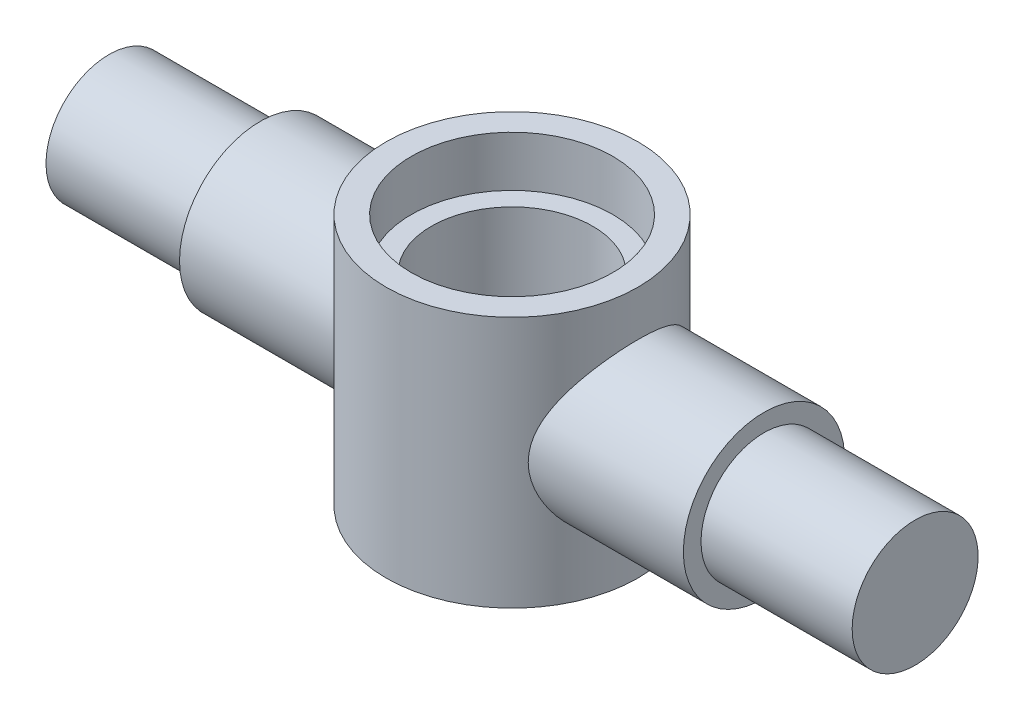
ISO-10303-21;
HEADER;
FILE_DESCRIPTION(('STEP AP214'),'2;1');
FILE_NAME('part.step','',(''),(''),'','','');
FILE_SCHEMA(('AUTOMOTIVE_DESIGN { 1 0 10303 214 1 1 1 1 }'));
ENDSEC;
DATA;
#1=APPLICATION_CONTEXT('core data for automotive mechanical design processes');
#2=APPLICATION_PROTOCOL_DEFINITION('international standard','automotive_design',2000,#1);
#3=PRODUCT_CONTEXT('',#1,'mechanical');
#4=PRODUCT('Part','Part','',(#3));
#5=PRODUCT_RELATED_PRODUCT_CATEGORY('part','',(#4));
#6=PRODUCT_DEFINITION_FORMATION('','',#4);
#7=PRODUCT_DEFINITION_CONTEXT('part definition',#1,'design');
#8=PRODUCT_DEFINITION('design','',#6,#7);
#9=PRODUCT_DEFINITION_SHAPE('','',#8);
#10=(LENGTH_UNIT() NAMED_UNIT(*) SI_UNIT(.MILLI.,.METRE.));
#11=(NAMED_UNIT(*) PLANE_ANGLE_UNIT() SI_UNIT($,.RADIAN.));
#12=(NAMED_UNIT(*) SI_UNIT($,.STERADIAN.) SOLID_ANGLE_UNIT());
#13=UNCERTAINTY_MEASURE_WITH_UNIT(LENGTH_MEASURE(1.E-05),#10,'distance_accuracy_value','');
#14=(GEOMETRIC_REPRESENTATION_CONTEXT(3) GLOBAL_UNCERTAINTY_ASSIGNED_CONTEXT((#13)) GLOBAL_UNIT_ASSIGNED_CONTEXT((#10,
#11,#12)) REPRESENTATION_CONTEXT('',''));
#15=CARTESIAN_POINT('',(0.,0.,0.));
#16=DIRECTION('',(0.,0.,1.));
#17=DIRECTION('',(1.,0.,0.));
#18=AXIS2_PLACEMENT_3D('',#15,#16,#17);
#19=CARTESIAN_POINT('',(0.,-25.,0.));
#20=DIRECTION('',(0.,1.,0.));
#21=DIRECTION('',(0.,0.,1.));
#22=AXIS2_PLACEMENT_3D('',#19,#20,#21);
#23=PLANE('',#22);
#24=CARTESIAN_POINT('',(0.,-25.,0.));
#25=DIRECTION('',(0.,1.,0.));
#26=DIRECTION('',(0.,0.,1.));
#27=AXIS2_PLACEMENT_3D('',#24,#25,#26);
#28=CIRCLE('',#27,25.);
#29=CARTESIAN_POINT('',(0.,-25.,25.));
#30=VERTEX_POINT('',#29);
#31=EDGE_CURVE('E50',#30,#30,#28,.T.);
#32=ORIENTED_EDGE('',*,*,#31,.F.);
#33=EDGE_LOOP('',(#32));
#34=FACE_BOUND('',#33,.T.);
#35=CARTESIAN_POINT('',(0.,-25.,0.));
#36=DIRECTION('',(0.,1.,0.));
#37=DIRECTION('',(0.,0.,1.));
#38=AXIS2_PLACEMENT_3D('',#35,#36,#37);
#39=CIRCLE('',#38,16.);
#40=CARTESIAN_POINT('',(0.,-25.,16.));
#41=VERTEX_POINT('',#40);
#42=EDGE_CURVE('E105',#41,#41,#39,.F.);
#43=ORIENTED_EDGE('',*,*,#42,.F.);
#44=EDGE_LOOP('',(#43));
#45=FACE_BOUND('',#44,.T.);
#46=ADVANCED_FACE('F37',(#34,#45),#23,.F.);
#47=CARTESIAN_POINT('',(0.,25.,0.));
#48=DIRECTION('',(0.,-1.,0.));
#49=DIRECTION('',(0.,0.,-1.));
#50=AXIS2_PLACEMENT_3D('',#47,#48,#49);
#51=CYLINDRICAL_SURFACE('',#50,25.);
#52=CARTESIAN_POINT('',(19.2093727122986,0.,16.));
#53=CARTESIAN_POINT('',(19.2093602004703,0.395450741818393,16.0000075518309));
#54=CARTESIAN_POINT('',(19.2216281701415,0.790830022740219,15.985318558414));
#55=CARTESIAN_POINT('',(19.2700828129892,1.57809681292205,15.9268763773465));
#56=CARTESIAN_POINT('',(19.3062771873145,1.96998315674333,15.8831138318213));
#57=CARTESIAN_POINT('',(19.4010060093011,2.74740735451356,15.7672610060305));
#58=CARTESIAN_POINT('',(19.4595765701312,3.13293388953269,15.695124927821));
#59=CARTESIAN_POINT('',(19.5965538328847,3.89425061412518,15.5237584274562));
#60=CARTESIAN_POINT('',(19.6749599547327,4.27004108806787,15.424528797624));
#61=CARTESIAN_POINT('',(19.8478677138076,5.00648391302579,15.2013768268568));
#62=CARTESIAN_POINT('',(19.9422183799563,5.36724195350467,15.0776843957441));
#63=CARTESIAN_POINT('',(20.1444634718839,6.07574987096303,14.8063905960499));
#64=CARTESIAN_POINT('',(20.2523599296603,6.42349778612011,14.6587856393958));
#65=CARTESIAN_POINT('',(20.4786703313642,7.10487336943404,14.34092425358));
#66=CARTESIAN_POINT('',(20.5970838421642,7.43850161825141,14.1706687570999));
#67=CARTESIAN_POINT('',(20.8415708471704,8.09089316911373,13.8085717175924));
#68=CARTESIAN_POINT('',(20.9676448352993,8.40965551030581,13.6167287819958));
#69=CARTESIAN_POINT('',(21.2429784742916,9.07571937888856,13.183726884198));
#70=CARTESIAN_POINT('',(21.3929937414824,9.42067256852972,12.9394311786344));
#71=CARTESIAN_POINT('',(21.6958102059326,10.0894536641919,12.4250119334488));
#72=CARTESIAN_POINT('',(21.8486115820407,10.4132802078776,12.1548867309956));
#73=CARTESIAN_POINT('',(22.153690243193,11.0390522050631,11.5895322792664));
#74=CARTESIAN_POINT('',(22.3059669935383,11.3409794346957,11.2942825562918));
#75=CARTESIAN_POINT('',(22.6066292638259,11.9214646022861,10.6797634395583));
#76=CARTESIAN_POINT('',(22.7550145449758,12.2000211084417,10.3604925764188));
#77=CARTESIAN_POINT('',(23.0635047016872,12.7667075937182,9.65613685196288));
#78=CARTESIAN_POINT('',(23.2226498605155,13.0514317810644,9.26787638476106));
#79=CARTESIAN_POINT('',(23.5277165227615,13.5868256125372,8.46354327157017));
#80=CARTESIAN_POINT('',(23.6736365980179,13.8374915802119,8.04746763026313));
#81=CARTESIAN_POINT('',(23.9479803876146,14.3017764357152,7.19003859126285));
#82=CARTESIAN_POINT('',(24.0764176374088,14.5154240190881,6.74870512893473));
#83=CARTESIAN_POINT('',(24.311987912098,14.9029000599008,5.84344355319202));
#84=CARTESIAN_POINT('',(24.4191250484791,15.0767362029889,5.37951982186268));
#85=CARTESIAN_POINT('',(24.5985926447151,15.3656160862095,4.48282903672906));
#86=CARTESIAN_POINT('',(24.6734013192139,15.4849249997567,4.05193075208175));
#87=CARTESIAN_POINT('',(24.801040881362,15.6875056250081,3.17853043332122));
#88=CARTESIAN_POINT('',(24.8538731689283,15.7707796321842,2.73602914024029));
#89=CARTESIAN_POINT('',(24.9359332327917,15.8997874849552,1.84383752201984));
#90=CARTESIAN_POINT('',(24.9651830643105,15.9455564074084,1.39415431610935));
#91=CARTESIAN_POINT('',(24.9992426632786,15.9988302400714,0.491624497686979));
#92=CARTESIAN_POINT('',(25.0040554585505,16.0063398907209,0.038778284044166));
#93=CARTESIAN_POINT('',(24.9901621157745,15.9846245464523,-0.80180702025826));
#94=CARTESIAN_POINT('',(24.9746698897481,15.9604195679006,-1.18974170793274));
#95=CARTESIAN_POINT('',(24.925916743737,15.8840233753194,-1.96167918510344));
#96=CARTESIAN_POINT('',(24.8926579243074,15.8318354697257,-2.34568243394718));
#97=CARTESIAN_POINT('',(24.809124943467,15.7001676417372,-3.10709482157081));
#98=CARTESIAN_POINT('',(24.7588500773314,15.6206865889864,-3.48450368656138));
#99=CARTESIAN_POINT('',(24.6423835379046,15.4354220324527,-4.23029490411503));
#100=CARTESIAN_POINT('',(24.5761911870474,15.3296374089885,-4.59867687169072));
#101=CARTESIAN_POINT('',(24.429246979534,15.0929359518799,-5.3243786114757));
#102=CARTESIAN_POINT('',(24.348491186878,14.9620123234025,-5.68169536247057));
#103=CARTESIAN_POINT('',(24.1740178828328,14.6763730310704,-6.38338290414122));
#104=CARTESIAN_POINT('',(24.0803005538868,14.5216577020982,-6.72775387695177));
#105=CARTESIAN_POINT('',(23.88162522246,14.1897742394937,-7.40213203498124));
#106=CARTESIAN_POINT('',(23.7766665635656,14.0126047945902,-7.73213837982412));
#107=CARTESIAN_POINT('',(23.5573305378522,13.6371200068658,-8.37663930224958));
#108=CARTESIAN_POINT('',(23.4429521112619,13.4388022840152,-8.69113212810154));
#109=CARTESIAN_POINT('',(23.1916461498523,12.9957628822917,-9.34261350029823));
#110=CARTESIAN_POINT('',(23.0537005367941,12.7483470877915,-9.67737906939421));
#111=CARTESIAN_POINT('',(22.7710425195163,12.2297848715424,-10.3249438913943));
#112=CARTESIAN_POINT('',(22.6263296265049,11.9586367344007,-10.6377415534904));
#113=CARTESIAN_POINT('',(22.3328215884758,11.3935639779314,-11.2408946521999));
#114=CARTESIAN_POINT('',(22.1840210043112,11.0996079572823,-11.5312180082151));
#115=CARTESIAN_POINT('',(21.8855595984986,10.4903882100913,-12.0880975088665));
#116=CARTESIAN_POINT('',(21.7358987343383,10.1751234221084,-12.3546524680053));
#117=CARTESIAN_POINT('',(21.4181651432605,9.47875337366145,-12.8986334479259));
#118=CARTESIAN_POINT('',(21.2504398360994,9.09460175903956,-13.1723794101635));
#119=CARTESIAN_POINT('',(20.9231280377543,8.3010823952978,-13.6863281692123));
#120=CARTESIAN_POINT('',(20.7635431930463,7.89170958165701,-13.9265241972136));
#121=CARTESIAN_POINT('',(20.4583462502362,7.04964812228661,-14.3711052241852));
#122=CARTESIAN_POINT('',(20.3127140688785,6.61699443242504,-14.5755420556062));
#123=CARTESIAN_POINT('',(20.1091927064436,5.95182141302221,-14.8537397354869));
#124=CARTESIAN_POINT('',(20.043847548657,5.72742835996075,-14.9417198388729));
#125=CARTESIAN_POINT('',(19.9188677051513,5.27341753747446,-15.107928903543));
#126=CARTESIAN_POINT('',(19.8592344402921,5.0437984855479,-15.1861554400348));
#127=CARTESIAN_POINT('',(19.720753651965,4.47386707312211,-15.3658713186935));
#128=CARTESIAN_POINT('',(19.645552574875,4.13084777878345,-15.4616911152537));
#129=CARTESIAN_POINT('',(19.5113255727846,3.43625908207935,-15.6307339070693));
#130=CARTESIAN_POINT('',(19.4522955441895,3.08469187354872,-15.7039626356712));
#131=CARTESIAN_POINT('',(19.3524938058948,2.37531516224826,-15.8267893922012));
#132=CARTESIAN_POINT('',(19.3116995928932,2.01751392232937,-15.8764165497243));
#133=CARTESIAN_POINT('',(19.24981462822,1.29766012634529,-15.9513955181357));
#134=CARTESIAN_POINT('',(19.2287241117882,0.935607519575857,-15.9767470392006));
#135=CARTESIAN_POINT('',(19.2070655710884,0.208914040156355,-16.0027787782538));
#136=CARTESIAN_POINT('',(19.2065587736387,-0.155731327892917,-16.0033853918813));
#137=CARTESIAN_POINT('',(19.2262437044411,-0.883646492477322,-15.9797303685735));
#138=CARTESIAN_POINT('',(19.2464355421881,-1.24691628172549,-15.9554686000853));
#139=CARTESIAN_POINT('',(19.3067193481981,-1.96956504405771,-15.8824686441803));
#140=CARTESIAN_POINT('',(19.3468257479805,-2.32894100212412,-15.8337127062304));
#141=CARTESIAN_POINT('',(19.4454047345737,-3.04108188334853,-15.7124891921192));
#142=CARTESIAN_POINT('',(19.5038777302889,-3.39384665913327,-15.640021088041));
#143=CARTESIAN_POINT('',(19.6353070822549,-4.08117003267903,-15.4746735603332));
#144=CARTESIAN_POINT('',(19.7078206333577,-4.4159625021135,-15.3824106552207));
#145=CARTESIAN_POINT('',(19.8661366285732,-5.07603904878437,-15.1773980264134));
#146=CARTESIAN_POINT('',(19.9519442856407,-5.40131933631819,-15.0646402631501));
#147=CARTESIAN_POINT('',(20.2259366590945,-6.36115702066661,-14.6970969552363));
#148=CARTESIAN_POINT('',(20.4307664709313,-6.98008445692646,-14.4129501324544));
#149=CARTESIAN_POINT('',(20.7791231934689,-7.92978311110473,-13.9025759153207));
#150=CARTESIAN_POINT('',(20.9141789774944,-8.27634446914636,-13.6990065677717));
#151=CARTESIAN_POINT('',(21.1904755475319,-8.95159599548266,-13.2676036626528));
#152=CARTESIAN_POINT('',(21.331716916245,-9.28028447353067,-13.0397678161961));
#153=CARTESIAN_POINT('',(21.617328622136,-9.91920804166723,-12.5606127955533));
#154=CARTESIAN_POINT('',(21.7617021658761,-10.2294228728555,-12.3092685900815));
#155=CARTESIAN_POINT('',(22.0504950386983,-10.83022156592,-11.7841200489597));
#156=CARTESIAN_POINT('',(22.1949143700021,-11.1208042527166,-11.5103143710492));
#157=CARTESIAN_POINT('',(22.5068806894766,-11.7320378290204,-10.8895251971102));
#158=CARTESIAN_POINT('',(22.6738912555057,-12.0486339518646,-10.538258852383));
#159=CARTESIAN_POINT('',(22.9997454081353,-12.6511856036189,-9.80673841828234));
#160=CARTESIAN_POINT('',(23.1585876314467,-12.9371360263668,-9.4264795162001));
#161=CARTESIAN_POINT('',(23.4637861759484,-13.4758482705846,-8.63879825507575));
#162=CARTESIAN_POINT('',(23.6101533508035,-13.7286390473383,-8.23140006944532));
#163=CARTESIAN_POINT('',(23.8173475602848,-14.081016674032,-7.60150490333189));
#164=CARTESIAN_POINT('',(23.8843490627493,-14.1940015577088,-7.38842079738171));
#165=CARTESIAN_POINT('',(24.013796129949,-14.4107587612229,-6.95618401063907));
#166=CARTESIAN_POINT('',(24.0762405186914,-14.5145287045721,-6.73702978339916));
#167=CARTESIAN_POINT('',(24.2320055848663,-14.7717973408357,-6.15995796925271));
#168=CARTESIAN_POINT('',(24.321400053688,-14.9178236369807,-5.79759896313244));
#169=CARTESIAN_POINT('',(24.4854315282584,-15.1837844441139,-5.06026412930272));
#170=CARTESIAN_POINT('',(24.5600711973213,-15.3037236643405,-4.68529059290349));
#171=CARTESIAN_POINT('',(24.6929742121903,-15.5161154342713,-3.92502403877743));
#172=CARTESIAN_POINT('',(24.7512476771231,-15.6085849703693,-3.53973755962495));
#173=CARTESIAN_POINT('',(24.8501510392655,-15.7649509257018,-2.76115486747051));
#174=CARTESIAN_POINT('',(24.8907806004012,-15.8288468006773,-2.36785850204885));
#175=CARTESIAN_POINT('',(24.9535312925749,-15.9273404409633,-1.57480221577731));
#176=CARTESIAN_POINT('',(24.9755905708137,-15.9618403003625,-1.17502517982108));
#177=CARTESIAN_POINT('',(25.0004272981601,-16.0006746513738,-0.37340562588085));
#178=CARTESIAN_POINT('',(25.0032047459269,-16.0050091408883,0.0284368922467654));
#179=CARTESIAN_POINT('',(24.9894083698085,-15.9834476229949,0.831001220465048));
#180=CARTESIAN_POINT('',(24.9728331376842,-15.9575494156401,1.23172294687187));
#181=CARTESIAN_POINT('',(24.9207400616191,-15.8759022758455,2.02885267808104));
#182=CARTESIAN_POINT('',(24.8852226810495,-15.8201540736094,2.42526078816294));
#183=CARTESIAN_POINT('',(24.7984189745796,-15.68324665588,3.19044626417198));
#184=CARTESIAN_POINT('',(24.7480444224836,-15.6035527406556,3.55959149260969));
#185=CARTESIAN_POINT('',(24.6320994030311,-15.4189971904594,4.28906417390255));
#186=CARTESIAN_POINT('',(24.5665295814812,-15.3141366250764,4.64939200078242));
#187=CARTESIAN_POINT('',(24.4214925565386,-15.0803746063925,5.35928858254075));
#188=CARTESIAN_POINT('',(24.3420245415617,-14.9514717491141,5.70885670770437));
#189=CARTESIAN_POINT('',(24.170683642612,-14.6708653525123,6.39556994704414));
#190=CARTESIAN_POINT('',(24.0788100748657,-14.5191605563319,6.73271437514202));
#191=CARTESIAN_POINT('',(23.8769190367743,-14.1819204834617,7.41821218958758));
#192=CARTESIAN_POINT('',(23.7660547293117,-13.9946940329281,7.76548374262893));
#193=CARTESIAN_POINT('',(23.533987358231,-13.5968623110591,8.44272462594596));
#194=CARTESIAN_POINT('',(23.4127838763452,-13.3862560937994,8.77269325536515));
#195=CARTESIAN_POINT('',(23.1621773907135,-12.942948547228,9.41447208281312));
#196=CARTESIAN_POINT('',(23.0327692434887,-12.7102333113594,9.72627065030754));
#197=CARTESIAN_POINT('',(22.7681033449974,-12.224078988506,10.3306501038477));
#198=CARTESIAN_POINT('',(22.6328450147247,-11.9706378480088,10.6232290804345));
#199=CARTESIAN_POINT('',(22.3378986081481,-11.4038990021542,11.2316218874087));
#200=CARTESIAN_POINT('',(22.1776354019021,-11.0873722519174,11.5441559130474));
#201=CARTESIAN_POINT('',(21.8562350326654,-10.4296383547697,12.1416680025961));
#202=CARTESIAN_POINT('',(21.6950977427163,-10.0884275286711,12.4266419437925));
#203=CARTESIAN_POINT('',(21.375928274595,-9.38240404588212,12.9679779160604));
#204=CARTESIAN_POINT('',(21.2178973024897,-9.01758244911156,13.2243290079454));
#205=CARTESIAN_POINT('',(20.9093760040417,-8.26556414666311,13.7069324509098));
#206=CARTESIAN_POINT('',(20.7588843294594,-7.87837146842732,13.933190195594));
#207=CARTESIAN_POINT('',(20.4904053646846,-7.13850609897016,14.3245055255624));
#208=CARTESIAN_POINT('',(20.3708181994352,-6.78859802866813,14.4936962326903));
#209=CARTESIAN_POINT('',(20.1439415106924,-6.07397381223699,14.8074000887338));
#210=CARTESIAN_POINT('',(20.0366521382654,-5.70925748427748,14.9519129345167));
#211=CARTESIAN_POINT('',(19.837970972326,-4.96714496507766,15.2145325262258));
#212=CARTESIAN_POINT('',(19.7465442856356,-4.58977884054345,15.3326973975323));
#213=CARTESIAN_POINT('',(19.5826454523431,-3.82361318584244,15.5414800751121));
#214=CARTESIAN_POINT('',(19.5101663424499,-3.43481791452256,15.6321080032872));
#215=CARTESIAN_POINT('',(19.3709744142914,-2.54459093114954,15.8044576067829));
#216=CARTESIAN_POINT('',(19.3107841815136,-2.04041323215055,15.8775776488039));
#217=CARTESIAN_POINT('',(19.2299909394771,-1.02411722304983,15.9753445575078));
#218=CARTESIAN_POINT('',(19.209388911636,-0.511998716407548,15.9999902224795));
#219=CARTESIAN_POINT('',(19.2093727122986,0.,16.));
#220=B_SPLINE_CURVE_WITH_KNOTS('',3,(#52,#53,#54,#55,#56,#57,#58,#59,#60,#61,#62,#63,#64,#65,
#66,#67,#68,#69,#70,#71,#72,#73,#74,#75,#76,#77,#78,#79,#80,#81,#82,#83,#84,#85,#86,#87,#88,#89,
#90,#91,#92,#93,#94,#95,#96,#97,#98,#99,#100,#101,#102,#103,#104,#105,#106,#107,#108,#109,#110,
#111,#112,#113,#114,#115,#116,#117,#118,#119,#120,#121,#122,#123,#124,#125,#126,#127,#128,#129,
#130,#131,#132,#133,#134,#135,#136,#137,#138,#139,#140,#141,#142,#143,#144,#145,#146,#147,#148,
#149,#150,#151,#152,#153,#154,#155,#156,#157,#158,#159,#160,#161,#162,#163,#164,#165,#166,#167,
#168,#169,#170,#171,#172,#173,#174,#175,#176,#177,#178,#179,#180,#181,#182,#183,#184,#185,#186,
#187,#188,#189,#190,#191,#192,#193,#194,#195,#196,#197,#198,#199,#200,#201,#202,#203,#204,#205,
#206,#207,#208,#209,#210,#211,#212,#213,#214,#215,#216,#217,#218,#219),.UNSPECIFIED.,.T.,.F.,(4,
2,2,2,2,2,2,2,2,2,2,2,2,2,2,2,2,2,2,2,2,2,2,2,2,2,2,2,2,2,2,2,2,2,2,2,2,2,2,2,2,2,2,2,2,2,2,2,2,
2,2,2,2,2,2,2,2,2,2,2,2,2,2,2,2,2,2,2,2,2,2,2,2,2,2,2,2,2,2,2,2,2,2,4),(0.,1.18577451563378,
2.3719308803307,3.56000973844409,4.74805385612807,5.92542182765322,7.10296662705878,
8.28046295368244,9.45803528219827,10.8023160446125,12.1466834064257,13.4921569662333,
14.8377128960858,16.3569602143826,17.876371399424,19.3945994612358,20.9125341796885,
22.2705040937008,23.6283874904697,24.9849994644068,26.3414433459186,27.5070310105171,
28.6724808974644,29.8379790577811,31.0035268391193,32.1693901015005,33.3352369551525,
34.501151923103,35.667198242016,36.981484304163,38.2958654425361,39.6120894425728,
40.9283790552945,42.4284846788317,43.9288925178196,45.4271071822748,46.1760210388416,
46.9251207099887,48.0159853843353,49.1065729819124,50.1958110356673,51.2850620935235,
52.3775529210132,53.4700495277666,54.5633389938717,55.6566528021364,56.7198824116748,
57.783530000594,59.909660789382,61.1808078676573,62.4520749505807,63.7247114101543,
64.9974239758645,66.5001130296406,68.0030520722831,69.5046698733183,70.2553847672213,
71.0062927079441,72.2072677819862,73.4080258757609,74.6080399052385,75.8080767910932,
77.0120950499146,78.2161133924543,79.4202193534207,80.6242958603643,81.7660234446159,
82.907702513756,84.0494482734538,85.1912569899844,86.4194532766274,87.6476992731068,
88.876723015927,90.1058686776879,91.5228092826637,92.9399615210125,94.3576535312389,
95.7750911063542,96.993925571275,98.2127750067777,99.4289083750165,100.644594180296,
102.179804297618,103.715052473312),.UNSPECIFIED.);
#221=CARTESIAN_POINT('',(19.2093727122986,0.,16.));
#222=VERTEX_POINT('',#221);
#223=EDGE_CURVE('E42',#222,#222,#220,.T.);
#224=ORIENTED_EDGE('',*,*,#223,.T.);
#225=EDGE_LOOP('',(#224));
#226=FACE_BOUND('',#225,.T.);
#227=CARTESIAN_POINT('',(-19.2093727122986,0.,16.));
#228=CARTESIAN_POINT('',(-19.2093602004703,-0.395450741818389,16.0000075518309));
#229=CARTESIAN_POINT('',(-19.2216281701415,-0.790830022740215,15.985318558414));
#230=CARTESIAN_POINT('',(-19.2700828129892,-1.57809681292204,15.9268763773465));
#231=CARTESIAN_POINT('',(-19.3062771873145,-1.96998315674333,15.8831138318213));
#232=CARTESIAN_POINT('',(-19.4010060093011,-2.74740735451356,15.7672610060305));
#233=CARTESIAN_POINT('',(-19.4595765701312,-3.13293388953269,15.695124927821));
#234=CARTESIAN_POINT('',(-19.5965538328847,-3.89425061412518,15.5237584274562));
#235=CARTESIAN_POINT('',(-19.6749599547327,-4.27004108806786,15.424528797624));
#236=CARTESIAN_POINT('',(-19.8478677138076,-5.00648391302578,15.2013768268568));
#237=CARTESIAN_POINT('',(-19.9422183799563,-5.36724195350466,15.0776843957441));
#238=CARTESIAN_POINT('',(-20.1444634718839,-6.07574987096302,14.8063905960499));
#239=CARTESIAN_POINT('',(-20.2523599296603,-6.42349778612011,14.6587856393958));
#240=CARTESIAN_POINT('',(-20.4786703313642,-7.10487336943404,14.34092425358));
#241=CARTESIAN_POINT('',(-20.5970838421642,-7.43850161825141,14.1706687570999));
#242=CARTESIAN_POINT('',(-20.8415708471704,-8.09089316911373,13.8085717175924));
#243=CARTESIAN_POINT('',(-20.9676448352993,-8.40965551030581,13.6167287819958));
#244=CARTESIAN_POINT('',(-21.2429784742916,-9.07571937888855,13.183726884198));
#245=CARTESIAN_POINT('',(-21.3929937414824,-9.42067256852972,12.9394311786344));
#246=CARTESIAN_POINT('',(-21.6958102059326,-10.0894536641919,12.4250119334488));
#247=CARTESIAN_POINT('',(-21.8486115820407,-10.4132802078776,12.1548867309956));
#248=CARTESIAN_POINT('',(-22.153690243193,-11.0390522050631,11.5895322792664));
#249=CARTESIAN_POINT('',(-22.3059669935383,-11.3409794346957,11.2942825562918));
#250=CARTESIAN_POINT('',(-22.6066292638259,-11.9214646022861,10.6797634395583));
#251=CARTESIAN_POINT('',(-22.7550145449758,-12.2000211084417,10.3604925764188));
#252=CARTESIAN_POINT('',(-23.0635047016872,-12.7667075937182,9.65613685196288));
#253=CARTESIAN_POINT('',(-23.2226498605155,-13.0514317810644,9.26787638476106));
#254=CARTESIAN_POINT('',(-23.5277165227615,-13.5868256125372,8.46354327157017));
#255=CARTESIAN_POINT('',(-23.6736365980179,-13.8374915802119,8.04746763026313));
#256=CARTESIAN_POINT('',(-23.9479803876146,-14.3017764357152,7.19003859126285));
#257=CARTESIAN_POINT('',(-24.0764176374088,-14.5154240190881,6.74870512893474));
#258=CARTESIAN_POINT('',(-24.311987912098,-14.9029000599008,5.84344355319202));
#259=CARTESIAN_POINT('',(-24.4191250484791,-15.0767362029889,5.37951982186268));
#260=CARTESIAN_POINT('',(-24.5985926447151,-15.3656160862095,4.48282903672906));
#261=CARTESIAN_POINT('',(-24.6734013192139,-15.4849249997567,4.05193075208175));
#262=CARTESIAN_POINT('',(-24.801040881362,-15.6875056250081,3.17853043332122));
#263=CARTESIAN_POINT('',(-24.8538731689283,-15.7707796321842,2.73602914024029));
#264=CARTESIAN_POINT('',(-24.9359332327917,-15.8997874849552,1.84383752201984));
#265=CARTESIAN_POINT('',(-24.9651830643105,-15.9455564074084,1.39415431610935));
#266=CARTESIAN_POINT('',(-24.9992426632786,-15.9988302400714,0.491624497686979));
#267=CARTESIAN_POINT('',(-25.0040554585505,-16.0063398907209,0.0387782840441663));
#268=CARTESIAN_POINT('',(-24.9901621157745,-15.9846245464523,-0.80180702025826));
#269=CARTESIAN_POINT('',(-24.9746698897481,-15.9604195679006,-1.18974170793274));
#270=CARTESIAN_POINT('',(-24.925916743737,-15.8840233753194,-1.96167918510344));
#271=CARTESIAN_POINT('',(-24.8926579243074,-15.8318354697257,-2.34568243394718));
#272=CARTESIAN_POINT('',(-24.809124943467,-15.7001676417372,-3.10709482157081));
#273=CARTESIAN_POINT('',(-24.7588500773314,-15.6206865889864,-3.48450368656138));
#274=CARTESIAN_POINT('',(-24.6423835379046,-15.4354220324527,-4.23029490411503));
#275=CARTESIAN_POINT('',(-24.5761911870474,-15.3296374089885,-4.59867687169072));
#276=CARTESIAN_POINT('',(-24.429246979534,-15.0929359518799,-5.3243786114757));
#277=CARTESIAN_POINT('',(-24.348491186878,-14.9620123234025,-5.68169536247057));
#278=CARTESIAN_POINT('',(-24.1740178828328,-14.6763730310703,-6.38338290414122));
#279=CARTESIAN_POINT('',(-24.0803005538868,-14.5216577020982,-6.72775387695177));
#280=CARTESIAN_POINT('',(-23.88162522246,-14.1897742394937,-7.40213203498124));
#281=CARTESIAN_POINT('',(-23.7766665635656,-14.0126047945902,-7.73213837982412));
#282=CARTESIAN_POINT('',(-23.5573305378522,-13.6371200068658,-8.37663930224958));
#283=CARTESIAN_POINT('',(-23.4429521112619,-13.4388022840152,-8.69113212810154));
#284=CARTESIAN_POINT('',(-23.1916461498523,-12.9957628822917,-9.34261350029823));
#285=CARTESIAN_POINT('',(-23.0537005367941,-12.7483470877915,-9.67737906939421));
#286=CARTESIAN_POINT('',(-22.7710425195163,-12.2297848715424,-10.3249438913943));
#287=CARTESIAN_POINT('',(-22.6263296265049,-11.9586367344007,-10.6377415534904));
#288=CARTESIAN_POINT('',(-22.3328215884758,-11.3935639779314,-11.2408946521999));
#289=CARTESIAN_POINT('',(-22.1840210043112,-11.0996079572823,-11.5312180082151));
#290=CARTESIAN_POINT('',(-21.8855595984986,-10.4903882100913,-12.0880975088665));
#291=CARTESIAN_POINT('',(-21.7358987343383,-10.1751234221084,-12.3546524680053));
#292=CARTESIAN_POINT('',(-21.4181651432605,-9.47875337366144,-12.8986334479259));
#293=CARTESIAN_POINT('',(-21.2504398360994,-9.09460175903955,-13.1723794101635));
#294=CARTESIAN_POINT('',(-20.9231280377543,-8.3010823952978,-13.6863281692123));
#295=CARTESIAN_POINT('',(-20.7635431930463,-7.89170958165701,-13.9265241972136));
#296=CARTESIAN_POINT('',(-20.4583462502362,-7.0496481222866,-14.3711052241852));
#297=CARTESIAN_POINT('',(-20.3127140688785,-6.61699443242503,-14.5755420556062));
#298=CARTESIAN_POINT('',(-20.1091927064436,-5.9518214130222,-14.8537397354869));
#299=CARTESIAN_POINT('',(-20.043847548657,-5.72742835996074,-14.9417198388729));
#300=CARTESIAN_POINT('',(-19.9188677051513,-5.27341753747446,-15.107928903543));
#301=CARTESIAN_POINT('',(-19.8592344402921,-5.0437984855479,-15.1861554400348));
#302=CARTESIAN_POINT('',(-19.720753651965,-4.4738670731221,-15.3658713186935));
#303=CARTESIAN_POINT('',(-19.645552574875,-4.13084777878345,-15.4616911152537));
#304=CARTESIAN_POINT('',(-19.5113255727846,-3.43625908207935,-15.6307339070693));
#305=CARTESIAN_POINT('',(-19.4522955441895,-3.08469187354872,-15.7039626356712));
#306=CARTESIAN_POINT('',(-19.3524938058948,-2.37531516224826,-15.8267893922012));
#307=CARTESIAN_POINT('',(-19.3116995928932,-2.01751392232936,-15.8764165497243));
#308=CARTESIAN_POINT('',(-19.24981462822,-1.29766012634528,-15.9513955181357));
#309=CARTESIAN_POINT('',(-19.2287241117882,-0.935607519575853,-15.9767470392006));
#310=CARTESIAN_POINT('',(-19.2070655710884,-0.208914040156351,-16.0027787782538));
#311=CARTESIAN_POINT('',(-19.2065587736387,0.155731327892921,-16.0033853918813));
#312=CARTESIAN_POINT('',(-19.2262437044411,0.883646492477326,-15.9797303685735));
#313=CARTESIAN_POINT('',(-19.2464355421881,1.2469162817255,-15.9554686000853));
#314=CARTESIAN_POINT('',(-19.3067193481981,1.96956504405772,-15.8824686441803));
#315=CARTESIAN_POINT('',(-19.3468257479805,2.32894100212412,-15.8337127062304));
#316=CARTESIAN_POINT('',(-19.4454047345737,3.04108188334853,-15.7124891921192));
#317=CARTESIAN_POINT('',(-19.5038777302889,3.39384665913327,-15.640021088041));
#318=CARTESIAN_POINT('',(-19.6353070822549,4.08117003267904,-15.4746735603332));
#319=CARTESIAN_POINT('',(-19.7078206333577,4.4159625021135,-15.3824106552207));
#320=CARTESIAN_POINT('',(-19.8661366285732,5.07603904878437,-15.1773980264134));
#321=CARTESIAN_POINT('',(-19.9519442856407,5.40131933631819,-15.0646402631501));
#322=CARTESIAN_POINT('',(-20.2259366590945,6.36115702066661,-14.6970969552363));
#323=CARTESIAN_POINT('',(-20.4307664709313,6.98008445692647,-14.4129501324544));
#324=CARTESIAN_POINT('',(-20.7791231934689,7.92978311110474,-13.9025759153207));
#325=CARTESIAN_POINT('',(-20.9141789774944,8.27634446914636,-13.6990065677717));
#326=CARTESIAN_POINT('',(-21.1904755475319,8.95159599548266,-13.2676036626528));
#327=CARTESIAN_POINT('',(-21.331716916245,9.28028447353067,-13.0397678161961));
#328=CARTESIAN_POINT('',(-21.617328622136,9.91920804166724,-12.5606127955533));
#329=CARTESIAN_POINT('',(-21.7617021658761,10.2294228728555,-12.3092685900815));
#330=CARTESIAN_POINT('',(-22.0504950386983,10.83022156592,-11.7841200489597));
#331=CARTESIAN_POINT('',(-22.1949143700021,11.1208042527166,-11.5103143710492));
#332=CARTESIAN_POINT('',(-22.5068806894766,11.7320378290204,-10.8895251971102));
#333=CARTESIAN_POINT('',(-22.6738912555057,12.0486339518646,-10.538258852383));
#334=CARTESIAN_POINT('',(-22.9997454081353,12.6511856036189,-9.80673841828234));
#335=CARTESIAN_POINT('',(-23.1585876314467,12.9371360263668,-9.4264795162001));
#336=CARTESIAN_POINT('',(-23.4637861759484,13.4758482705846,-8.63879825507575));
#337=CARTESIAN_POINT('',(-23.6101533508035,13.7286390473383,-8.23140006944532));
#338=CARTESIAN_POINT('',(-23.8173475602848,14.0810166740321,-7.60150490333189));
#339=CARTESIAN_POINT('',(-23.8843490627493,14.1940015577088,-7.38842079738171));
#340=CARTESIAN_POINT('',(-24.013796129949,14.4107587612229,-6.95618401063907));
#341=CARTESIAN_POINT('',(-24.0762405186914,14.5145287045721,-6.73702978339916));
#342=CARTESIAN_POINT('',(-24.2320055848663,14.7717973408357,-6.15995796925271));
#343=CARTESIAN_POINT('',(-24.321400053688,14.9178236369807,-5.79759896313243));
#344=CARTESIAN_POINT('',(-24.4854315282584,15.1837844441139,-5.06026412930271));
#345=CARTESIAN_POINT('',(-24.5600711973214,15.3037236643405,-4.68529059290349));
#346=CARTESIAN_POINT('',(-24.6929742121902,15.5161154342713,-3.92502403877743));
#347=CARTESIAN_POINT('',(-24.7512476771231,15.6085849703693,-3.53973755962495));
#348=CARTESIAN_POINT('',(-24.8501510392655,15.7649509257018,-2.76115486747051));
#349=CARTESIAN_POINT('',(-24.8907806004012,15.8288468006773,-2.36785850204885));
#350=CARTESIAN_POINT('',(-24.9535312925749,15.9273404409633,-1.57480221577731));
#351=CARTESIAN_POINT('',(-24.9755905708137,15.9618403003625,-1.17502517982108));
#352=CARTESIAN_POINT('',(-25.0004272981601,16.0006746513738,-0.37340562588085));
#353=CARTESIAN_POINT('',(-25.0032047459269,16.0050091408883,0.0284368922467656));
#354=CARTESIAN_POINT('',(-24.9894083698085,15.9834476229949,0.831001220465048));
#355=CARTESIAN_POINT('',(-24.9728331376842,15.9575494156401,1.23172294687187));
#356=CARTESIAN_POINT('',(-24.9207400616191,15.8759022758455,2.02885267808104));
#357=CARTESIAN_POINT('',(-24.8852226810495,15.8201540736094,2.42526078816294));
#358=CARTESIAN_POINT('',(-24.7984189745796,15.68324665588,3.19044626417198));
#359=CARTESIAN_POINT('',(-24.7480444224836,15.6035527406556,3.55959149260969));
#360=CARTESIAN_POINT('',(-24.6320994030311,15.4189971904594,4.28906417390255));
#361=CARTESIAN_POINT('',(-24.5665295814812,15.3141366250765,4.64939200078242));
#362=CARTESIAN_POINT('',(-24.4214925565386,15.0803746063925,5.35928858254075));
#363=CARTESIAN_POINT('',(-24.3420245415617,14.9514717491141,5.70885670770437));
#364=CARTESIAN_POINT('',(-24.170683642612,14.6708653525123,6.39556994704414));
#365=CARTESIAN_POINT('',(-24.0788100748657,14.5191605563319,6.73271437514203));
#366=CARTESIAN_POINT('',(-23.8769190367743,14.1819204834617,7.41821218958758));
#367=CARTESIAN_POINT('',(-23.7660547293117,13.9946940329281,7.76548374262893));
#368=CARTESIAN_POINT('',(-23.533987358231,13.5968623110591,8.44272462594596));
#369=CARTESIAN_POINT('',(-23.4127838763452,13.3862560937994,8.77269325536515));
#370=CARTESIAN_POINT('',(-23.1621773907135,12.942948547228,9.41447208281312));
#371=CARTESIAN_POINT('',(-23.0327692434887,12.7102333113594,9.72627065030754));
#372=CARTESIAN_POINT('',(-22.7681033449974,12.224078988506,10.3306501038477));
#373=CARTESIAN_POINT('',(-22.6328450147247,11.9706378480088,10.6232290804345));
#374=CARTESIAN_POINT('',(-22.3378986081481,11.4038990021542,11.2316218874087));
#375=CARTESIAN_POINT('',(-22.1776354019021,11.0873722519174,11.5441559130474));
#376=CARTESIAN_POINT('',(-21.8562350326654,10.4296383547697,12.1416680025961));
#377=CARTESIAN_POINT('',(-21.6950977427163,10.0884275286712,12.4266419437925));
#378=CARTESIAN_POINT('',(-21.375928274595,9.38240404588212,12.9679779160604));
#379=CARTESIAN_POINT('',(-21.2178973024897,9.01758244911156,13.2243290079454));
#380=CARTESIAN_POINT('',(-20.9093760040417,8.26556414666312,13.7069324509098));
#381=CARTESIAN_POINT('',(-20.7588843294594,7.87837146842733,13.933190195594));
#382=CARTESIAN_POINT('',(-20.4904053646846,7.13850609897016,14.3245055255624));
#383=CARTESIAN_POINT('',(-20.3708181994352,6.78859802866813,14.4936962326903));
#384=CARTESIAN_POINT('',(-20.1439415106924,6.073973812237,14.8074000887338));
#385=CARTESIAN_POINT('',(-20.0366521382654,5.70925748427748,14.9519129345167));
#386=CARTESIAN_POINT('',(-19.837970972326,4.96714496507767,15.2145325262258));
#387=CARTESIAN_POINT('',(-19.7465442856356,4.58977884054345,15.3326973975323));
#388=CARTESIAN_POINT('',(-19.5826454523431,3.82361318584245,15.5414800751121));
#389=CARTESIAN_POINT('',(-19.5101663424499,3.43481791452257,15.6321080032872));
#390=CARTESIAN_POINT('',(-19.3709744142914,2.54459093114954,15.8044576067829));
#391=CARTESIAN_POINT('',(-19.3107841815136,2.04041323215055,15.8775776488039));
#392=CARTESIAN_POINT('',(-19.2299909394771,1.02411722304983,15.9753445575078));
#393=CARTESIAN_POINT('',(-19.209388911636,0.511998716407551,15.9999902224795));
#394=CARTESIAN_POINT('',(-19.2093727122986,0.,16.));
#395=B_SPLINE_CURVE_WITH_KNOTS('',3,(#227,#228,#229,#230,#231,#232,#233,#234,#235,#236,#237,
#238,#239,#240,#241,#242,#243,#244,#245,#246,#247,#248,#249,#250,#251,#252,#253,#254,#255,#256,
#257,#258,#259,#260,#261,#262,#263,#264,#265,#266,#267,#268,#269,#270,#271,#272,#273,#274,#275,
#276,#277,#278,#279,#280,#281,#282,#283,#284,#285,#286,#287,#288,#289,#290,#291,#292,#293,#294,
#295,#296,#297,#298,#299,#300,#301,#302,#303,#304,#305,#306,#307,#308,#309,#310,#311,#312,#313,
#314,#315,#316,#317,#318,#319,#320,#321,#322,#323,#324,#325,#326,#327,#328,#329,#330,#331,#332,
#333,#334,#335,#336,#337,#338,#339,#340,#341,#342,#343,#344,#345,#346,#347,#348,#349,#350,#351,
#352,#353,#354,#355,#356,#357,#358,#359,#360,#361,#362,#363,#364,#365,#366,#367,#368,#369,#370,
#371,#372,#373,#374,#375,#376,#377,#378,#379,#380,#381,#382,#383,#384,#385,#386,#387,#388,#389,
#390,#391,#392,#393,#394),.UNSPECIFIED.,.T.,.F.,(4,2,2,2,2,2,2,2,2,2,2,2,2,2,2,2,2,2,2,2,2,2,2,
2,2,2,2,2,2,2,2,2,2,2,2,2,2,2,2,2,2,2,2,2,2,2,2,2,2,2,2,2,2,2,2,2,2,2,2,2,2,2,2,2,2,2,2,2,2,2,2,
2,2,2,2,2,2,2,2,2,2,2,2,4),(0.,1.18577451563378,2.3719308803307,3.56000973844409,
4.74805385612807,5.92542182765322,7.10296662705878,8.28046295368244,9.45803528219827,
10.8023160446125,12.1466834064257,13.4921569662333,14.8377128960858,16.3569602143826,
17.876371399424,19.3945994612358,20.9125341796885,22.2705040937008,23.6283874904697,
24.9849994644068,26.3414433459186,27.5070310105171,28.6724808974644,29.8379790577811,
31.0035268391193,32.1693901015005,33.3352369551525,34.501151923103,35.667198242016,
36.981484304163,38.2958654425361,39.6120894425728,40.9283790552945,42.4284846788317,
43.9288925178196,45.4271071822749,46.1760210388416,46.9251207099887,48.0159853843353,
49.1065729819124,50.1958110356673,51.2850620935235,52.3775529210132,53.4700495277666,
54.5633389938717,55.6566528021364,56.7198824116748,57.783530000594,59.909660789382,
61.1808078676573,62.4520749505808,63.7247114101544,64.9974239758645,66.5001130296407,
68.0030520722831,69.5046698733183,70.2553847672213,71.0062927079441,72.2072677819862,
73.4080258757609,74.6080399052385,75.8080767910932,77.0120950499146,78.2161133924543,
79.4202193534207,80.6242958603643,81.7660234446159,82.9077025137561,84.0494482734538,
85.1912569899844,86.4194532766274,87.6476992731069,88.8767230159271,90.1058686776879,
91.5228092826637,92.9399615210125,94.3576535312389,95.7750911063542,96.993925571275,
98.2127750067777,99.4289083750165,100.644594180296,102.179804297618,103.715052473312),.UNSPECIFIED.);
#396=CARTESIAN_POINT('',(-19.2093727122986,0.,16.));
#397=VERTEX_POINT('',#396);
#398=EDGE_CURVE('E59',#397,#397,#395,.T.);
#399=ORIENTED_EDGE('',*,*,#398,.T.);
#400=EDGE_LOOP('',(#399));
#401=FACE_BOUND('',#400,.T.);
#402=CARTESIAN_POINT('',(0.,25.,0.));
#403=DIRECTION('',(0.,1.,0.));
#404=DIRECTION('',(0.,0.,1.));
#405=AXIS2_PLACEMENT_3D('',#402,#403,#404);
#406=CIRCLE('',#405,25.);
#407=CARTESIAN_POINT('',(0.,25.,25.));
#408=VERTEX_POINT('',#407);
#409=EDGE_CURVE('E10',#408,#408,#406,.T.);
#410=ORIENTED_EDGE('',*,*,#409,.F.);
#411=EDGE_LOOP('',(#410));
#412=FACE_BOUND('',#411,.T.);
#413=ORIENTED_EDGE('',*,*,#31,.T.);
#414=EDGE_LOOP('',(#413));
#415=FACE_BOUND('',#414,.T.);
#416=ADVANCED_FACE('F39',(#226,#401,#412,#415),#51,.T.);
#417=CARTESIAN_POINT('',(0.,25.,0.));
#418=DIRECTION('',(0.,1.,0.));
#419=DIRECTION('',(0.,0.,1.));
#420=AXIS2_PLACEMENT_3D('',#417,#418,#419);
#421=PLANE('',#420);
#422=CARTESIAN_POINT('',(0.,25.,0.));
#423=DIRECTION('',(0.,1.,0.));
#424=DIRECTION('',(0.,0.,1.));
#425=AXIS2_PLACEMENT_3D('',#422,#423,#424);
#426=CIRCLE('',#425,20.);
#427=CARTESIAN_POINT('',(0.,25.,20.));
#428=VERTEX_POINT('',#427);
#429=EDGE_CURVE('E117',#428,#428,#426,.T.);
#430=ORIENTED_EDGE('',*,*,#429,.F.);
#431=EDGE_LOOP('',(#430));
#432=FACE_BOUND('',#431,.T.);
#433=ORIENTED_EDGE('',*,*,#409,.T.);
#434=EDGE_LOOP('',(#433));
#435=FACE_BOUND('',#434,.T.);
#436=ADVANCED_FACE('F91',(#432,#435),#421,.T.);
#437=CARTESIAN_POINT('',(-80.,12.5,0.));
#438=DIRECTION('',(1.,0.,0.));
#439=DIRECTION('',(0.,0.,-1.));
#440=AXIS2_PLACEMENT_3D('',#437,#438,#439);
#441=PLANE('',#440);
#442=CARTESIAN_POINT('',(-80.,0.,0.));
#443=DIRECTION('',(-1.,0.,0.));
#444=DIRECTION('',(0.,0.,1.));
#445=AXIS2_PLACEMENT_3D('',#442,#443,#444);
#446=CIRCLE('',#445,12.5);
#447=CARTESIAN_POINT('',(-80.,0.,12.5));
#448=VERTEX_POINT('',#447);
#449=EDGE_CURVE('E107',#448,#448,#446,.T.);
#450=ORIENTED_EDGE('',*,*,#449,.T.);
#451=EDGE_LOOP('',(#450));
#452=FACE_BOUND('',#451,.T.);
#453=ADVANCED_FACE('F87',(#452),#441,.F.);
#454=CARTESIAN_POINT('',(-80.,0.,0.));
#455=DIRECTION('',(-1.,0.,0.));
#456=DIRECTION('',(0.,0.,1.));
#457=AXIS2_PLACEMENT_3D('',#454,#455,#456);
#458=CYLINDRICAL_SURFACE('',#457,12.5);
#459=ORIENTED_EDGE('',*,*,#449,.F.);
#460=EDGE_LOOP('',(#459));
#461=FACE_BOUND('',#460,.T.);
#462=CARTESIAN_POINT('',(-50.,0.,0.));
#463=DIRECTION('',(-1.,0.,0.));
#464=DIRECTION('',(0.,0.,1.));
#465=AXIS2_PLACEMENT_3D('',#462,#463,#464);
#466=CIRCLE('',#465,12.5);
#467=CARTESIAN_POINT('',(-50.,0.,12.5));
#468=VERTEX_POINT('',#467);
#469=EDGE_CURVE('E111',#468,#468,#466,.T.);
#470=ORIENTED_EDGE('',*,*,#469,.T.);
#471=EDGE_LOOP('',(#470));
#472=FACE_BOUND('',#471,.T.);
#473=ADVANCED_FACE('F90',(#461,#472),#458,.T.);
#474=CARTESIAN_POINT('',(-50.,16.,0.));
#475=DIRECTION('',(1.,0.,0.));
#476=DIRECTION('',(0.,0.,-1.));
#477=AXIS2_PLACEMENT_3D('',#474,#475,#476);
#478=PLANE('',#477);
#479=ORIENTED_EDGE('',*,*,#469,.F.);
#480=EDGE_LOOP('',(#479));
#481=FACE_BOUND('',#480,.T.);
#482=CARTESIAN_POINT('',(-50.,0.,0.));
#483=DIRECTION('',(-1.,0.,0.));
#484=DIRECTION('',(0.,0.,1.));
#485=AXIS2_PLACEMENT_3D('',#482,#483,#484);
#486=CIRCLE('',#485,16.);
#487=CARTESIAN_POINT('',(-50.,0.,16.));
#488=VERTEX_POINT('',#487);
#489=EDGE_CURVE('E124',#488,#488,#486,.T.);
#490=ORIENTED_EDGE('',*,*,#489,.T.);
#491=EDGE_LOOP('',(#490));
#492=FACE_BOUND('',#491,.T.);
#493=ADVANCED_FACE('F72',(#481,#492),#478,.F.);
#494=CARTESIAN_POINT('',(-80.,0.,0.));
#495=DIRECTION('',(-1.,0.,0.));
#496=DIRECTION('',(0.,0.,1.));
#497=AXIS2_PLACEMENT_3D('',#494,#495,#496);
#498=CYLINDRICAL_SURFACE('',#497,16.);
#499=ORIENTED_EDGE('',*,*,#489,.F.);
#500=EDGE_LOOP('',(#499));
#501=FACE_BOUND('',#500,.T.);
#502=ORIENTED_EDGE('',*,*,#398,.F.);
#503=EDGE_LOOP('',(#502));
#504=FACE_BOUND('',#503,.T.);
#505=ADVANCED_FACE('F70',(#501,#504),#498,.T.);
#506=CARTESIAN_POINT('',(50.,0.,0.));
#507=DIRECTION('',(-1.,0.,0.));
#508=DIRECTION('',(0.,0.,1.));
#509=AXIS2_PLACEMENT_3D('',#506,#507,#508);
#510=CIRCLE('',#509,16.);
#511=CARTESIAN_POINT('',(50.,0.,16.));
#512=VERTEX_POINT('',#511);
#513=EDGE_CURVE('E127',#512,#512,#510,.T.);
#514=ORIENTED_EDGE('',*,*,#513,.T.);
#515=EDGE_LOOP('',(#514));
#516=FACE_BOUND('',#515,.T.);
#517=ORIENTED_EDGE('',*,*,#223,.F.);
#518=EDGE_LOOP('',(#517));
#519=FACE_BOUND('',#518,.T.);
#520=ADVANCED_FACE('F64',(#516,#519),#498,.T.);
#521=CARTESIAN_POINT('',(80.,12.5,0.));
#522=DIRECTION('',(1.,0.,0.));
#523=DIRECTION('',(0.,0.,-1.));
#524=AXIS2_PLACEMENT_3D('',#521,#522,#523);
#525=PLANE('',#524);
#526=CARTESIAN_POINT('',(80.,0.,0.));
#527=DIRECTION('',(-1.,0.,0.));
#528=DIRECTION('',(0.,0.,1.));
#529=AXIS2_PLACEMENT_3D('',#526,#527,#528);
#530=CIRCLE('',#529,12.5);
#531=CARTESIAN_POINT('',(80.,0.,12.5));
#532=VERTEX_POINT('',#531);
#533=EDGE_CURVE('E57',#532,#532,#530,.T.);
#534=ORIENTED_EDGE('',*,*,#533,.F.);
#535=EDGE_LOOP('',(#534));
#536=FACE_BOUND('',#535,.T.);
#537=ADVANCED_FACE('F69',(#536),#525,.T.);
#538=CARTESIAN_POINT('',(-80.,0.,0.));
#539=DIRECTION('',(-1.,0.,0.));
#540=DIRECTION('',(0.,0.,1.));
#541=AXIS2_PLACEMENT_3D('',#538,#539,#540);
#542=CYLINDRICAL_SURFACE('',#541,12.5);
#543=ORIENTED_EDGE('',*,*,#533,.T.);
#544=EDGE_LOOP('',(#543));
#545=FACE_BOUND('',#544,.T.);
#546=CARTESIAN_POINT('',(50.,0.,0.));
#547=DIRECTION('',(-1.,0.,0.));
#548=DIRECTION('',(0.,0.,1.));
#549=AXIS2_PLACEMENT_3D('',#546,#547,#548);
#550=CIRCLE('',#549,12.5);
#551=CARTESIAN_POINT('',(50.,0.,12.5));
#552=VERTEX_POINT('',#551);
#553=EDGE_CURVE('E129',#552,#552,#550,.T.);
#554=ORIENTED_EDGE('',*,*,#553,.F.);
#555=EDGE_LOOP('',(#554));
#556=FACE_BOUND('',#555,.T.);
#557=ADVANCED_FACE('F79',(#545,#556),#542,.T.);
#558=CARTESIAN_POINT('',(50.,16.,0.));
#559=DIRECTION('',(1.,0.,0.));
#560=DIRECTION('',(0.,0.,-1.));
#561=AXIS2_PLACEMENT_3D('',#558,#559,#560);
#562=PLANE('',#561);
#563=ORIENTED_EDGE('',*,*,#553,.T.);
#564=EDGE_LOOP('',(#563));
#565=FACE_BOUND('',#564,.T.);
#566=ORIENTED_EDGE('',*,*,#513,.F.);
#567=EDGE_LOOP('',(#566));
#568=FACE_BOUND('',#567,.T.);
#569=ADVANCED_FACE('F74',(#565,#568),#562,.T.);
#570=CARTESIAN_POINT('',(0.,25.,0.));
#571=DIRECTION('',(0.,1.,0.));
#572=DIRECTION('',(0.,0.,1.));
#573=AXIS2_PLACEMENT_3D('',#570,#571,#572);
#574=CYLINDRICAL_SURFACE('',#573,16.);
#575=ORIENTED_EDGE('',*,*,#42,.T.);
#576=EDGE_LOOP('',(#575));
#577=FACE_BOUND('',#576,.T.);
#578=CARTESIAN_POINT('',(0.,15.,0.));
#579=DIRECTION('',(0.,1.,0.));
#580=DIRECTION('',(0.,0.,1.));
#581=AXIS2_PLACEMENT_3D('',#578,#579,#580);
#582=CIRCLE('',#581,16.);
#583=CARTESIAN_POINT('',(0.,15.,16.));
#584=VERTEX_POINT('',#583);
#585=EDGE_CURVE('E108',#584,#584,#582,.T.);
#586=ORIENTED_EDGE('',*,*,#585,.T.);
#587=EDGE_LOOP('',(#586));
#588=FACE_BOUND('',#587,.T.);
#589=ADVANCED_FACE('F78',(#577,#588),#574,.F.);
#590=CARTESIAN_POINT('',(16.,15.,0.));
#591=DIRECTION('',(0.,-1.,0.));
#592=DIRECTION('',(0.,0.,-1.));
#593=AXIS2_PLACEMENT_3D('',#590,#591,#592);
#594=PLANE('',#593);
#595=ORIENTED_EDGE('',*,*,#585,.F.);
#596=EDGE_LOOP('',(#595));
#597=FACE_BOUND('',#596,.T.);
#598=CARTESIAN_POINT('',(0.,15.,0.));
#599=DIRECTION('',(0.,1.,0.));
#600=DIRECTION('',(0.,0.,1.));
#601=AXIS2_PLACEMENT_3D('',#598,#599,#600);
#602=CIRCLE('',#601,20.);
#603=CARTESIAN_POINT('',(0.,15.,20.));
#604=VERTEX_POINT('',#603);
#605=EDGE_CURVE('E114',#604,#604,#602,.T.);
#606=ORIENTED_EDGE('',*,*,#605,.T.);
#607=EDGE_LOOP('',(#606));
#608=FACE_BOUND('',#607,.T.);
#609=ADVANCED_FACE('F165',(#597,#608),#594,.F.);
#610=CARTESIAN_POINT('',(0.,25.,0.));
#611=DIRECTION('',(0.,1.,0.));
#612=DIRECTION('',(0.,0.,1.));
#613=AXIS2_PLACEMENT_3D('',#610,#611,#612);
#614=CYLINDRICAL_SURFACE('',#613,20.);
#615=ORIENTED_EDGE('',*,*,#605,.F.);
#616=EDGE_LOOP('',(#615));
#617=FACE_BOUND('',#616,.T.);
#618=ORIENTED_EDGE('',*,*,#429,.T.);
#619=EDGE_LOOP('',(#618));
#620=FACE_BOUND('',#619,.T.);
#621=ADVANCED_FACE('F168',(#617,#620),#614,.F.);
#622=CLOSED_SHELL('',(#46,#416,#436,#453,#473,#493,#505,#520,#537,#557,#569,#589,#609,#621));
#623=MANIFOLD_SOLID_BREP('B2',#622);
#624=ADVANCED_BREP_SHAPE_REPRESENTATION('',(#18,#623),#14);
#625=SHAPE_DEFINITION_REPRESENTATION(#9,#624);
ENDSEC;
END-ISO-10303-21;
